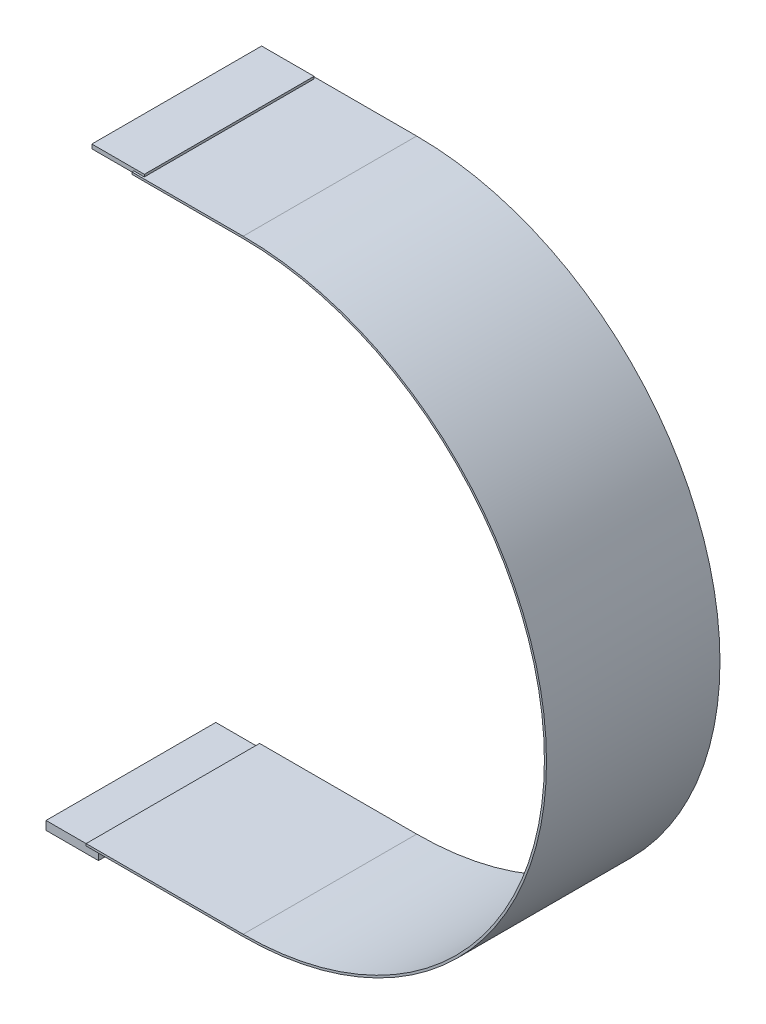
ISO-10303-21;
HEADER;
FILE_DESCRIPTION(('STEP AP214'),'2;1');
FILE_NAME('part.step','',(''),(''),'','','');
FILE_SCHEMA(('AUTOMOTIVE_DESIGN { 1 0 10303 214 1 1 1 1 }'));
ENDSEC;
DATA;
#1=APPLICATION_CONTEXT('core data for automotive mechanical design processes');
#2=APPLICATION_PROTOCOL_DEFINITION('international standard','automotive_design',2000,#1);
#3=PRODUCT_CONTEXT('',#1,'mechanical');
#4=PRODUCT('Part','Part','',(#3));
#5=PRODUCT_RELATED_PRODUCT_CATEGORY('part','',(#4));
#6=PRODUCT_DEFINITION_FORMATION('','',#4);
#7=PRODUCT_DEFINITION_CONTEXT('part definition',#1,'design');
#8=PRODUCT_DEFINITION('design','',#6,#7);
#9=PRODUCT_DEFINITION_SHAPE('','',#8);
#10=(LENGTH_UNIT() NAMED_UNIT(*) SI_UNIT(.MILLI.,.METRE.));
#11=(NAMED_UNIT(*) PLANE_ANGLE_UNIT() SI_UNIT($,.RADIAN.));
#12=(NAMED_UNIT(*) SI_UNIT($,.STERADIAN.) SOLID_ANGLE_UNIT());
#13=UNCERTAINTY_MEASURE_WITH_UNIT(LENGTH_MEASURE(1.E-05),#10,'distance_accuracy_value','');
#14=(GEOMETRIC_REPRESENTATION_CONTEXT(3) GLOBAL_UNCERTAINTY_ASSIGNED_CONTEXT((#13)) GLOBAL_UNIT_ASSIGNED_CONTEXT((#10,
#11,#12)) REPRESENTATION_CONTEXT('',''));
#15=CARTESIAN_POINT('',(0.,0.,0.));
#16=DIRECTION('',(0.,0.,1.));
#17=DIRECTION('',(1.,0.,0.));
#18=AXIS2_PLACEMENT_3D('',#15,#16,#17);
#19=CARTESIAN_POINT('',(0.,0.254000000000004,10.5));
#20=DIRECTION('',(1.,0.,0.));
#21=DIRECTION('',(0.,0.,-1.));
#22=AXIS2_PLACEMENT_3D('',#19,#20,#21);
#23=PLANE('',#22);
#24=DIRECTION('',(0.,0.,-1.));
#25=VECTOR('',#24,1.);
#26=CARTESIAN_POINT('',(0.,0.,10.5));
#27=LINE('',#26,#25);
#28=CARTESIAN_POINT('',(0.,0.,-10.2743));
#29=VERTEX_POINT('',#28);
#30=CARTESIAN_POINT('',(0.,0.,-10.5));
#31=VERTEX_POINT('',#30);
#32=EDGE_CURVE('E352',#29,#31,#27,.T.);
#33=ORIENTED_EDGE('',*,*,#32,.F.);
#34=DIRECTION('',(0.,1.,0.));
#35=VECTOR('',#34,1.);
#36=CARTESIAN_POINT('',(0.,0.254000000000004,-10.2743));
#37=LINE('',#36,#35);
#38=CARTESIAN_POINT('',(0.,0.0253999999999949,-10.2743));
#39=VERTEX_POINT('',#38);
#40=EDGE_CURVE('E77',#29,#39,#37,.T.);
#41=ORIENTED_EDGE('',*,*,#40,.T.);
#42=DIRECTION('',(0.,0.,1.));
#43=VECTOR('',#42,1.);
#44=CARTESIAN_POINT('',(0.,0.0253999999999949,10.5));
#45=LINE('',#44,#43);
#46=CARTESIAN_POINT('',(0.,0.0253999999999949,10.2743));
#47=VERTEX_POINT('',#46);
#48=EDGE_CURVE('E363',#39,#47,#45,.T.);
#49=ORIENTED_EDGE('',*,*,#48,.T.);
#50=DIRECTION('',(0.,-1.,0.));
#51=VECTOR('',#50,1.);
#52=CARTESIAN_POINT('',(0.,0.254000000000004,10.2743));
#53=LINE('',#52,#51);
#54=CARTESIAN_POINT('',(0.,0.,10.2743));
#55=VERTEX_POINT('',#54);
#56=EDGE_CURVE('E277',#47,#55,#53,.T.);
#57=ORIENTED_EDGE('',*,*,#56,.T.);
#58=CARTESIAN_POINT('',(0.,0.,10.5));
#59=VERTEX_POINT('',#58);
#60=EDGE_CURVE('E353',#59,#55,#27,.T.);
#61=ORIENTED_EDGE('',*,*,#60,.F.);
#62=DIRECTION('',(0.,-1.,0.));
#63=VECTOR('',#62,1.);
#64=CARTESIAN_POINT('',(0.,0.254000000000004,10.5));
#65=LINE('',#64,#63);
#66=CARTESIAN_POINT('',(0.,0.254000000000004,10.5));
#67=VERTEX_POINT('',#66);
#68=EDGE_CURVE('E286',#67,#59,#65,.T.);
#69=ORIENTED_EDGE('',*,*,#68,.F.);
#70=DIRECTION('',(0.,0.,-1.));
#71=VECTOR('',#70,1.);
#72=CARTESIAN_POINT('',(0.,0.254000000000004,10.5));
#73=LINE('',#72,#71);
#74=CARTESIAN_POINT('',(0.,0.254000000000004,-10.5));
#75=VERTEX_POINT('',#74);
#76=EDGE_CURVE('E305',#67,#75,#73,.T.);
#77=ORIENTED_EDGE('',*,*,#76,.T.);
#78=DIRECTION('',(0.,-1.,0.));
#79=VECTOR('',#78,1.);
#80=CARTESIAN_POINT('',(0.,0.254000000000004,-10.5));
#81=LINE('',#80,#79);
#82=EDGE_CURVE('E285',#75,#31,#81,.T.);
#83=ORIENTED_EDGE('',*,*,#82,.T.);
#84=EDGE_LOOP('',(#33,#41,#49,#57,#61,#69,#77,#83));
#85=FACE_BOUND('',#84,.T.);
#86=ADVANCED_FACE('F51',(#85),#23,.F.);
#87=CARTESIAN_POINT('',(0.,0.,10.5));
#88=DIRECTION('',(0.,1.,0.));
#89=DIRECTION('',(0.,0.,1.));
#90=AXIS2_PLACEMENT_3D('',#87,#88,#89);
#91=PLANE('',#90);
#92=DIRECTION('',(0.,0.,1.));
#93=VECTOR('',#92,1.);
#94=CARTESIAN_POINT('',(1.27,0.,10.5));
#95=LINE('',#94,#93);
#96=CARTESIAN_POINT('',(1.27,0.,-10.2743));
#97=VERTEX_POINT('',#96);
#98=CARTESIAN_POINT('',(1.27,0.,10.2743));
#99=VERTEX_POINT('',#98);
#100=EDGE_CURVE('E356',#97,#99,#95,.T.);
#101=ORIENTED_EDGE('',*,*,#100,.F.);
#102=DIRECTION('',(-1.,0.,0.));
#103=VECTOR('',#102,1.);
#104=CARTESIAN_POINT('',(0.,0.,-10.2743));
#105=LINE('',#104,#103);
#106=EDGE_CURVE('E361',#97,#29,#105,.T.);
#107=ORIENTED_EDGE('',*,*,#106,.T.);
#108=ORIENTED_EDGE('',*,*,#32,.T.);
#109=DIRECTION('',(1.,0.,0.));
#110=VECTOR('',#109,1.);
#111=CARTESIAN_POINT('',(0.,0.,-10.5));
#112=LINE('',#111,#110);
#113=CARTESIAN_POINT('',(19.01175011,0.,-10.5));
#114=VERTEX_POINT('',#113);
#115=EDGE_CURVE('E308',#31,#114,#112,.T.);
#116=ORIENTED_EDGE('',*,*,#115,.T.);
#117=DIRECTION('',(0.,0.,-1.));
#118=VECTOR('',#117,1.);
#119=CARTESIAN_POINT('',(19.01175011,0.,10.5));
#120=LINE('',#119,#118);
#121=CARTESIAN_POINT('',(19.01175011,0.,10.5));
#122=VERTEX_POINT('',#121);
#123=EDGE_CURVE('E349',#122,#114,#120,.T.);
#124=ORIENTED_EDGE('',*,*,#123,.F.);
#125=DIRECTION('',(1.,0.,0.));
#126=VECTOR('',#125,1.);
#127=CARTESIAN_POINT('',(0.,0.,10.5));
#128=LINE('',#127,#126);
#129=EDGE_CURVE('E289',#59,#122,#128,.T.);
#130=ORIENTED_EDGE('',*,*,#129,.F.);
#131=ORIENTED_EDGE('',*,*,#60,.T.);
#132=DIRECTION('',(1.,0.,0.));
#133=VECTOR('',#132,1.);
#134=CARTESIAN_POINT('',(0.,0.,10.2743));
#135=LINE('',#134,#133);
#136=EDGE_CURVE('E359',#55,#99,#135,.T.);
#137=ORIENTED_EDGE('',*,*,#136,.T.);
#138=EDGE_LOOP('',(#101,#107,#108,#116,#124,#130,#131,#137));
#139=FACE_BOUND('',#138,.T.);
#140=ADVANCED_FACE('F419',(#139),#91,.F.);
#141=CARTESIAN_POINT('',(19.01175011,36.714875008,10.5));
#142=DIRECTION('',(0.,0.,-1.));
#143=DIRECTION('',(-1.,0.,0.));
#144=AXIS2_PLACEMENT_3D('',#141,#142,#143);
#145=CYLINDRICAL_SURFACE('',#144,36.714875008);
#146=CARTESIAN_POINT('',(19.01175011,36.714875008,-10.5));
#147=DIRECTION('',(0.,0.,1.));
#148=DIRECTION('',(1.,0.,0.));
#149=AXIS2_PLACEMENT_3D('',#146,#147,#148);
#150=CIRCLE('',#149,36.714875008);
#151=CARTESIAN_POINT('',(19.01175011,73.429750016,-10.5));
#152=VERTEX_POINT('',#151);
#153=EDGE_CURVE('E311',#114,#152,#150,.T.);
#154=ORIENTED_EDGE('',*,*,#153,.T.);
#155=DIRECTION('',(0.,0.,-1.));
#156=VECTOR('',#155,1.);
#157=CARTESIAN_POINT('',(19.01175011,73.429750016,10.5));
#158=LINE('',#157,#156);
#159=CARTESIAN_POINT('',(19.01175011,73.429750016,10.5));
#160=VERTEX_POINT('',#159);
#161=EDGE_CURVE('E345',#160,#152,#158,.T.);
#162=ORIENTED_EDGE('',*,*,#161,.F.);
#163=CARTESIAN_POINT('',(19.01175011,36.714875008,10.5));
#164=DIRECTION('',(0.,0.,1.));
#165=DIRECTION('',(1.,0.,0.));
#166=AXIS2_PLACEMENT_3D('',#163,#164,#165);
#167=CIRCLE('',#166,36.714875008);
#168=EDGE_CURVE('E292',#122,#160,#167,.T.);
#169=ORIENTED_EDGE('',*,*,#168,.F.);
#170=ORIENTED_EDGE('',*,*,#123,.T.);
#171=EDGE_LOOP('',(#154,#162,#169,#170));
#172=FACE_BOUND('',#171,.T.);
#173=ADVANCED_FACE('F424',(#172),#145,.T.);
#174=CARTESIAN_POINT('',(19.01175011,73.429750016,10.5));
#175=DIRECTION('',(0.,-1.,0.));
#176=DIRECTION('',(0.,0.,-1.));
#177=AXIS2_PLACEMENT_3D('',#174,#175,#176);
#178=PLANE('',#177);
#179=DIRECTION('',(0.,0.,-1.));
#180=VECTOR('',#179,1.);
#181=CARTESIAN_POINT('',(5.549000018,73.429750016,10.5));
#182=LINE('',#181,#180);
#183=CARTESIAN_POINT('',(5.549000018,73.429750016,-10.2743));
#184=VERTEX_POINT('',#183);
#185=CARTESIAN_POINT('',(5.549000018,73.429750016,-10.5));
#186=VERTEX_POINT('',#185);
#187=EDGE_CURVE('E341',#184,#186,#182,.T.);
#188=ORIENTED_EDGE('',*,*,#187,.F.);
#189=DIRECTION('',(1.,0.,0.));
#190=VECTOR('',#189,1.);
#191=CARTESIAN_POINT('',(19.01175011,73.429750016,-10.2743));
#192=LINE('',#191,#190);
#193=CARTESIAN_POINT('',(6.8190000179995,73.429750016,-10.2743));
#194=VERTEX_POINT('',#193);
#195=EDGE_CURVE('E250',#184,#194,#192,.T.);
#196=ORIENTED_EDGE('',*,*,#195,.T.);
#197=DIRECTION('',(0.,0.,1.));
#198=VECTOR('',#197,1.);
#199=CARTESIAN_POINT('',(6.8190000179995,73.429750016,10.5));
#200=LINE('',#199,#198);
#201=CARTESIAN_POINT('',(6.8190000179995,73.429750016,10.2743));
#202=VERTEX_POINT('',#201);
#203=EDGE_CURVE('E11',#194,#202,#200,.T.);
#204=ORIENTED_EDGE('',*,*,#203,.T.);
#205=DIRECTION('',(-1.,0.,0.));
#206=VECTOR('',#205,1.);
#207=CARTESIAN_POINT('',(19.01175011,73.429750016,10.2743));
#208=LINE('',#207,#206);
#209=CARTESIAN_POINT('',(5.549000018,73.429750016,10.2743));
#210=VERTEX_POINT('',#209);
#211=EDGE_CURVE('E242',#202,#210,#208,.T.);
#212=ORIENTED_EDGE('',*,*,#211,.T.);
#213=CARTESIAN_POINT('',(5.549000018,73.429750016,10.5));
#214=VERTEX_POINT('',#213);
#215=EDGE_CURVE('E342',#214,#210,#182,.T.);
#216=ORIENTED_EDGE('',*,*,#215,.F.);
#217=DIRECTION('',(-1.,0.,0.));
#218=VECTOR('',#217,1.);
#219=CARTESIAN_POINT('',(19.01175011,73.429750016,10.5));
#220=LINE('',#219,#218);
#221=EDGE_CURVE('E294',#160,#214,#220,.T.);
#222=ORIENTED_EDGE('',*,*,#221,.F.);
#223=ORIENTED_EDGE('',*,*,#161,.T.);
#224=DIRECTION('',(-1.,0.,0.));
#225=VECTOR('',#224,1.);
#226=CARTESIAN_POINT('',(19.01175011,73.429750016,-10.5));
#227=LINE('',#226,#225);
#228=EDGE_CURVE('E314',#152,#186,#227,.T.);
#229=ORIENTED_EDGE('',*,*,#228,.T.);
#230=EDGE_LOOP('',(#188,#196,#204,#212,#216,#222,#223,#229));
#231=FACE_BOUND('',#230,.T.);
#232=ADVANCED_FACE('F376',(#231),#178,.F.);
#233=CARTESIAN_POINT('',(5.549000018,73.429750016,10.5));
#234=DIRECTION('',(1.,0.,0.));
#235=DIRECTION('',(0.,0.,-1.));
#236=AXIS2_PLACEMENT_3D('',#233,#234,#235);
#237=PLANE('',#236);
#238=DIRECTION('',(0.,0.,-1.));
#239=VECTOR('',#238,1.);
#240=CARTESIAN_POINT('',(5.549000018,73.201150016,10.5));
#241=LINE('',#240,#239);
#242=CARTESIAN_POINT('',(5.549000018,73.201150016,10.2743));
#243=VERTEX_POINT('',#242);
#244=CARTESIAN_POINT('',(5.549000018,73.201150016,-10.2743));
#245=VERTEX_POINT('',#244);
#246=EDGE_CURVE('E365',#243,#245,#241,.T.);
#247=ORIENTED_EDGE('',*,*,#246,.T.);
#248=DIRECTION('',(0.,1.,0.));
#249=VECTOR('',#248,1.);
#250=CARTESIAN_POINT('',(5.549000018,73.429750016,-10.2743));
#251=LINE('',#250,#249);
#252=EDGE_CURVE('E59',#245,#184,#251,.T.);
#253=ORIENTED_EDGE('',*,*,#252,.T.);
#254=ORIENTED_EDGE('',*,*,#187,.T.);
#255=DIRECTION('',(0.,-1.,0.));
#256=VECTOR('',#255,1.);
#257=CARTESIAN_POINT('',(5.549000018,73.429750016,-10.5));
#258=LINE('',#257,#256);
#259=CARTESIAN_POINT('',(5.549000018,73.175750016,-10.5));
#260=VERTEX_POINT('',#259);
#261=EDGE_CURVE('E318',#186,#260,#258,.T.);
#262=ORIENTED_EDGE('',*,*,#261,.T.);
#263=DIRECTION('',(0.,0.,-1.));
#264=VECTOR('',#263,1.);
#265=CARTESIAN_POINT('',(5.549000018,73.175750016,10.5));
#266=LINE('',#265,#264);
#267=CARTESIAN_POINT('',(5.549000018,73.175750016,10.5));
#268=VERTEX_POINT('',#267);
#269=EDGE_CURVE('E337',#268,#260,#266,.T.);
#270=ORIENTED_EDGE('',*,*,#269,.F.);
#271=DIRECTION('',(0.,-1.,0.));
#272=VECTOR('',#271,1.);
#273=CARTESIAN_POINT('',(5.549000018,73.429750016,10.5));
#274=LINE('',#273,#272);
#275=EDGE_CURVE('E296',#214,#268,#274,.T.);
#276=ORIENTED_EDGE('',*,*,#275,.F.);
#277=ORIENTED_EDGE('',*,*,#215,.T.);
#278=DIRECTION('',(0.,-1.,0.));
#279=VECTOR('',#278,1.);
#280=CARTESIAN_POINT('',(5.549000018,73.429750016,10.2743));
#281=LINE('',#280,#279);
#282=EDGE_CURVE('E368',#210,#243,#281,.T.);
#283=ORIENTED_EDGE('',*,*,#282,.T.);
#284=EDGE_LOOP('',(#247,#253,#254,#262,#270,#276,#277,#283));
#285=FACE_BOUND('',#284,.T.);
#286=ADVANCED_FACE('F374',(#285),#237,.F.);
#287=CARTESIAN_POINT('',(19.01175011,73.175750016,10.5));
#288=DIRECTION('',(0.,1.,0.));
#289=DIRECTION('',(0.,0.,1.));
#290=AXIS2_PLACEMENT_3D('',#287,#288,#289);
#291=PLANE('',#290);
#292=DIRECTION('',(1.,0.,0.));
#293=VECTOR('',#292,1.);
#294=CARTESIAN_POINT('',(19.01175011,73.175750016,-10.5));
#295=LINE('',#294,#293);
#296=CARTESIAN_POINT('',(19.01175011,73.175750016,-10.5));
#297=VERTEX_POINT('',#296);
#298=EDGE_CURVE('E321',#260,#297,#295,.T.);
#299=ORIENTED_EDGE('',*,*,#298,.T.);
#300=DIRECTION('',(0.,0.,-1.));
#301=VECTOR('',#300,1.);
#302=CARTESIAN_POINT('',(19.01175011,73.175750016,10.5));
#303=LINE('',#302,#301);
#304=CARTESIAN_POINT('',(19.01175011,73.175750016,10.5));
#305=VERTEX_POINT('',#304);
#306=EDGE_CURVE('E333',#305,#297,#303,.T.);
#307=ORIENTED_EDGE('',*,*,#306,.F.);
#308=DIRECTION('',(1.,0.,0.));
#309=VECTOR('',#308,1.);
#310=CARTESIAN_POINT('',(19.01175011,73.175750016,10.5));
#311=LINE('',#310,#309);
#312=EDGE_CURVE('E298',#268,#305,#311,.T.);
#313=ORIENTED_EDGE('',*,*,#312,.F.);
#314=ORIENTED_EDGE('',*,*,#269,.T.);
#315=EDGE_LOOP('',(#299,#307,#313,#314));
#316=FACE_BOUND('',#315,.T.);
#317=ADVANCED_FACE('F391',(#316),#291,.F.);
#318=CARTESIAN_POINT('',(19.01175011,36.714875008,10.5));
#319=DIRECTION('',(0.,0.,-1.));
#320=DIRECTION('',(-1.,0.,0.));
#321=AXIS2_PLACEMENT_3D('',#318,#319,#320);
#322=CYLINDRICAL_SURFACE('',#321,36.460875008);
#323=CARTESIAN_POINT('',(19.01175011,36.714875008,-10.5));
#324=DIRECTION('',(0.,0.,-1.));
#325=DIRECTION('',(1.,0.,0.));
#326=AXIS2_PLACEMENT_3D('',#323,#324,#325);
#327=CIRCLE('',#326,36.460875008);
#328=CARTESIAN_POINT('',(19.01175011,0.254000000000004,-10.5));
#329=VERTEX_POINT('',#328);
#330=EDGE_CURVE('E324',#297,#329,#327,.T.);
#331=ORIENTED_EDGE('',*,*,#330,.T.);
#332=DIRECTION('',(0.,0.,-1.));
#333=VECTOR('',#332,1.);
#334=CARTESIAN_POINT('',(19.01175011,0.254000000000004,10.5));
#335=LINE('',#334,#333);
#336=CARTESIAN_POINT('',(19.01175011,0.254000000000004,10.5));
#337=VERTEX_POINT('',#336);
#338=EDGE_CURVE('E330',#337,#329,#335,.T.);
#339=ORIENTED_EDGE('',*,*,#338,.F.);
#340=CARTESIAN_POINT('',(19.01175011,36.714875008,10.5));
#341=DIRECTION('',(0.,0.,-1.));
#342=DIRECTION('',(1.,0.,0.));
#343=AXIS2_PLACEMENT_3D('',#340,#341,#342);
#344=CIRCLE('',#343,36.460875008);
#345=EDGE_CURVE('E300',#305,#337,#344,.T.);
#346=ORIENTED_EDGE('',*,*,#345,.F.);
#347=ORIENTED_EDGE('',*,*,#306,.T.);
#348=EDGE_LOOP('',(#331,#339,#346,#347));
#349=FACE_BOUND('',#348,.T.);
#350=ADVANCED_FACE('F466',(#349),#322,.F.);
#351=CARTESIAN_POINT('',(0.,0.254000000000004,10.5));
#352=DIRECTION('',(0.,-1.,0.));
#353=DIRECTION('',(0.,0.,-1.));
#354=AXIS2_PLACEMENT_3D('',#351,#352,#353);
#355=PLANE('',#354);
#356=DIRECTION('',(-1.,0.,0.));
#357=VECTOR('',#356,1.);
#358=CARTESIAN_POINT('',(0.,0.254000000000004,-10.5));
#359=LINE('',#358,#357);
#360=EDGE_CURVE('E290',#329,#75,#359,.T.);
#361=ORIENTED_EDGE('',*,*,#360,.T.);
#362=ORIENTED_EDGE('',*,*,#76,.F.);
#363=DIRECTION('',(-1.,0.,0.));
#364=VECTOR('',#363,1.);
#365=CARTESIAN_POINT('',(0.,0.254000000000004,10.5));
#366=LINE('',#365,#364);
#367=EDGE_CURVE('E302',#337,#67,#366,.T.);
#368=ORIENTED_EDGE('',*,*,#367,.F.);
#369=ORIENTED_EDGE('',*,*,#338,.T.);
#370=EDGE_LOOP('',(#361,#362,#368,#369));
#371=FACE_BOUND('',#370,.T.);
#372=ADVANCED_FACE('F468',(#371),#355,.F.);
#373=CARTESIAN_POINT('',(19.01175011,36.714875008,10.5));
#374=DIRECTION('',(0.,0.,1.));
#375=DIRECTION('',(1.,0.,0.));
#376=AXIS2_PLACEMENT_3D('',#373,#374,#375);
#377=PLANE('',#376);
#378=ORIENTED_EDGE('',*,*,#68,.T.);
#379=ORIENTED_EDGE('',*,*,#129,.T.);
#380=ORIENTED_EDGE('',*,*,#168,.T.);
#381=ORIENTED_EDGE('',*,*,#221,.T.);
#382=ORIENTED_EDGE('',*,*,#275,.T.);
#383=ORIENTED_EDGE('',*,*,#312,.T.);
#384=ORIENTED_EDGE('',*,*,#345,.T.);
#385=ORIENTED_EDGE('',*,*,#367,.T.);
#386=EDGE_LOOP('',(#378,#379,#380,#381,#382,#383,#384,#385));
#387=FACE_BOUND('',#386,.T.);
#388=ADVANCED_FACE('F395',(#387),#377,.T.);
#389=CARTESIAN_POINT('',(19.01175011,36.714875008,-10.5));
#390=DIRECTION('',(0.,0.,1.));
#391=DIRECTION('',(1.,0.,0.));
#392=AXIS2_PLACEMENT_3D('',#389,#390,#391);
#393=PLANE('',#392);
#394=ORIENTED_EDGE('',*,*,#82,.F.);
#395=ORIENTED_EDGE('',*,*,#360,.F.);
#396=ORIENTED_EDGE('',*,*,#330,.F.);
#397=ORIENTED_EDGE('',*,*,#298,.F.);
#398=ORIENTED_EDGE('',*,*,#261,.F.);
#399=ORIENTED_EDGE('',*,*,#228,.F.);
#400=ORIENTED_EDGE('',*,*,#153,.F.);
#401=ORIENTED_EDGE('',*,*,#115,.F.);
#402=EDGE_LOOP('',(#394,#395,#396,#397,#398,#399,#400,#401));
#403=FACE_BOUND('',#402,.T.);
#404=ADVANCED_FACE('F385',(#403),#393,.F.);
#405=CARTESIAN_POINT('',(1.27,0.0253999999999949,-10.2743));
#406=DIRECTION('',(0.,1.,0.));
#407=DIRECTION('',(0.,0.,1.));
#408=AXIS2_PLACEMENT_3D('',#405,#406,#407);
#409=PLANE('',#408);
#410=ORIENTED_EDGE('',*,*,#48,.F.);
#411=DIRECTION('',(-1.,0.,0.));
#412=VECTOR('',#411,1.);
#413=CARTESIAN_POINT('',(1.27,0.0253999999999949,-10.2743));
#414=LINE('',#413,#412);
#415=CARTESIAN_POINT('',(-5.08,0.0253999999999949,-10.2743));
#416=VERTEX_POINT('',#415);
#417=EDGE_CURVE('E275',#39,#416,#414,.T.);
#418=ORIENTED_EDGE('',*,*,#417,.T.);
#419=DIRECTION('',(0.,0.,-1.));
#420=VECTOR('',#419,1.);
#421=CARTESIAN_POINT('',(-5.08,0.0253999999999949,-10.2743));
#422=LINE('',#421,#420);
#423=CARTESIAN_POINT('',(-5.08000000000001,0.0253999999999949,10.2743));
#424=VERTEX_POINT('',#423);
#425=EDGE_CURVE('E263',#424,#416,#422,.T.);
#426=ORIENTED_EDGE('',*,*,#425,.F.);
#427=DIRECTION('',(-1.,0.,0.));
#428=VECTOR('',#427,1.);
#429=CARTESIAN_POINT('',(1.27,0.0253999999999949,10.2743));
#430=LINE('',#429,#428);
#431=EDGE_CURVE('E278',#47,#424,#430,.T.);
#432=ORIENTED_EDGE('',*,*,#431,.F.);
#433=EDGE_LOOP('',(#410,#418,#426,#432));
#434=FACE_BOUND('',#433,.T.);
#435=ADVANCED_FACE('F435',(#434),#409,.T.);
#436=CARTESIAN_POINT('',(1.27,0.0253999999999949,-10.2743));
#437=DIRECTION('',(0.,0.,-1.));
#438=DIRECTION('',(-1.,0.,0.));
#439=AXIS2_PLACEMENT_3D('',#436,#437,#438);
#440=PLANE('',#439);
#441=ORIENTED_EDGE('',*,*,#40,.F.);
#442=ORIENTED_EDGE('',*,*,#106,.F.);
#443=DIRECTION('',(0.,-1.,0.));
#444=VECTOR('',#443,1.);
#445=CARTESIAN_POINT('',(1.27,0.0253999999999949,-10.2743));
#446=LINE('',#445,#444);
#447=CARTESIAN_POINT('',(1.27,-1.016,-10.2743));
#448=VERTEX_POINT('',#447);
#449=EDGE_CURVE('E266',#97,#448,#446,.T.);
#450=ORIENTED_EDGE('',*,*,#449,.T.);
#451=DIRECTION('',(-1.,0.,0.));
#452=VECTOR('',#451,1.);
#453=CARTESIAN_POINT('',(1.27,-1.016,-10.2743));
#454=LINE('',#453,#452);
#455=CARTESIAN_POINT('',(-5.08,-1.016,-10.2743));
#456=VERTEX_POINT('',#455);
#457=EDGE_CURVE('E274',#448,#456,#454,.T.);
#458=ORIENTED_EDGE('',*,*,#457,.T.);
#459=DIRECTION('',(0.,-1.,0.));
#460=VECTOR('',#459,1.);
#461=CARTESIAN_POINT('',(-5.08,0.0253999999999949,-10.2743));
#462=LINE('',#461,#460);
#463=EDGE_CURVE('E254',#416,#456,#462,.T.);
#464=ORIENTED_EDGE('',*,*,#463,.F.);
#465=ORIENTED_EDGE('',*,*,#417,.F.);
#466=EDGE_LOOP('',(#441,#442,#450,#458,#464,#465));
#467=FACE_BOUND('',#466,.T.);
#468=ADVANCED_FACE('F430',(#467),#440,.T.);
#469=CARTESIAN_POINT('',(1.27,0.0253999999999949,10.2743));
#470=DIRECTION('',(0.,0.,1.));
#471=DIRECTION('',(1.,0.,0.));
#472=AXIS2_PLACEMENT_3D('',#469,#470,#471);
#473=PLANE('',#472);
#474=ORIENTED_EDGE('',*,*,#56,.F.);
#475=ORIENTED_EDGE('',*,*,#431,.T.);
#476=DIRECTION('',(0.,1.,0.));
#477=VECTOR('',#476,1.);
#478=CARTESIAN_POINT('',(-5.08000000000001,0.0253999999999949,10.2743));
#479=LINE('',#478,#477);
#480=CARTESIAN_POINT('',(-5.08000000000001,-1.016,10.2743));
#481=VERTEX_POINT('',#480);
#482=EDGE_CURVE('E260',#481,#424,#479,.T.);
#483=ORIENTED_EDGE('',*,*,#482,.F.);
#484=DIRECTION('',(-1.,0.,0.));
#485=VECTOR('',#484,1.);
#486=CARTESIAN_POINT('',(1.27,-1.016,10.2743));
#487=LINE('',#486,#485);
#488=CARTESIAN_POINT('',(1.27,-1.016,10.2743));
#489=VERTEX_POINT('',#488);
#490=EDGE_CURVE('E280',#489,#481,#487,.T.);
#491=ORIENTED_EDGE('',*,*,#490,.F.);
#492=DIRECTION('',(0.,1.,0.));
#493=VECTOR('',#492,1.);
#494=CARTESIAN_POINT('',(1.27,0.0253999999999949,10.2743));
#495=LINE('',#494,#493);
#496=EDGE_CURVE('E271',#489,#99,#495,.T.);
#497=ORIENTED_EDGE('',*,*,#496,.T.);
#498=ORIENTED_EDGE('',*,*,#136,.F.);
#499=EDGE_LOOP('',(#474,#475,#483,#491,#497,#498));
#500=FACE_BOUND('',#499,.T.);
#501=ADVANCED_FACE('F443',(#500),#473,.T.);
#502=CARTESIAN_POINT('',(1.27,0.,0.));
#503=DIRECTION('',(-1.,0.,0.));
#504=DIRECTION('',(0.,0.,1.));
#505=AXIS2_PLACEMENT_3D('',#502,#503,#504);
#506=PLANE('',#505);
#507=ORIENTED_EDGE('',*,*,#449,.F.);
#508=ORIENTED_EDGE('',*,*,#100,.T.);
#509=ORIENTED_EDGE('',*,*,#496,.F.);
#510=DIRECTION('',(0.,0.,1.));
#511=VECTOR('',#510,1.);
#512=CARTESIAN_POINT('',(1.27,-1.016,-10.2743));
#513=LINE('',#512,#511);
#514=EDGE_CURVE('E268',#448,#489,#513,.T.);
#515=ORIENTED_EDGE('',*,*,#514,.F.);
#516=EDGE_LOOP('',(#507,#508,#509,#515));
#517=FACE_BOUND('',#516,.T.);
#518=ADVANCED_FACE('F481',(#517),#506,.F.);
#519=CARTESIAN_POINT('',(1.27,-1.016,-10.2743));
#520=DIRECTION('',(0.,-1.,0.));
#521=DIRECTION('',(0.,0.,-1.));
#522=AXIS2_PLACEMENT_3D('',#519,#520,#521);
#523=PLANE('',#522);
#524=ORIENTED_EDGE('',*,*,#490,.T.);
#525=DIRECTION('',(0.,0.,1.));
#526=VECTOR('',#525,1.);
#527=CARTESIAN_POINT('',(-5.08,-1.016,-10.2743));
#528=LINE('',#527,#526);
#529=EDGE_CURVE('E257',#456,#481,#528,.T.);
#530=ORIENTED_EDGE('',*,*,#529,.F.);
#531=ORIENTED_EDGE('',*,*,#457,.F.);
#532=ORIENTED_EDGE('',*,*,#514,.T.);
#533=EDGE_LOOP('',(#524,#530,#531,#532));
#534=FACE_BOUND('',#533,.T.);
#535=ADVANCED_FACE('F478',(#534),#523,.T.);
#536=CARTESIAN_POINT('',(-5.08,0.,0.));
#537=DIRECTION('',(-1.,0.,0.));
#538=DIRECTION('',(0.,0.,1.));
#539=AXIS2_PLACEMENT_3D('',#536,#537,#538);
#540=PLANE('',#539);
#541=ORIENTED_EDGE('',*,*,#463,.T.);
#542=ORIENTED_EDGE('',*,*,#529,.T.);
#543=ORIENTED_EDGE('',*,*,#482,.T.);
#544=ORIENTED_EDGE('',*,*,#425,.T.);
#545=EDGE_LOOP('',(#541,#542,#543,#544));
#546=FACE_BOUND('',#545,.T.);
#547=ADVANCED_FACE('F438',(#546),#540,.T.);
#548=CARTESIAN_POINT('',(6.819000018,0.,0.));
#549=DIRECTION('',(1.,0.,0.));
#550=DIRECTION('',(0.,1.,0.));
#551=AXIS2_PLACEMENT_3D('',#548,#549,#550);
#552=PLANE('',#551);
#553=ORIENTED_EDGE('',*,*,#203,.F.);
#554=DIRECTION('',(0.,-1.,0.));
#555=VECTOR('',#554,1.);
#556=CARTESIAN_POINT('',(6.8190000179995,73.201150016,-10.2743));
#557=LINE('',#556,#555);
#558=CARTESIAN_POINT('',(6.8190000179995,73.709150016,-10.2743));
#559=VERTEX_POINT('',#558);
#560=EDGE_CURVE('E230',#559,#194,#557,.T.);
#561=ORIENTED_EDGE('',*,*,#560,.F.);
#562=DIRECTION('',(0.,0.,-1.));
#563=VECTOR('',#562,1.);
#564=CARTESIAN_POINT('',(6.8190000179995,73.709150016,-10.2743));
#565=LINE('',#564,#563);
#566=CARTESIAN_POINT('',(6.81900001799949,73.709150016,10.2743));
#567=VERTEX_POINT('',#566);
#568=EDGE_CURVE('E205',#567,#559,#565,.T.);
#569=ORIENTED_EDGE('',*,*,#568,.F.);
#570=DIRECTION('',(0.,1.,0.));
#571=VECTOR('',#570,1.);
#572=CARTESIAN_POINT('',(6.8190000179995,73.201150016,10.2743));
#573=LINE('',#572,#571);
#574=EDGE_CURVE('E234',#202,#567,#573,.T.);
#575=ORIENTED_EDGE('',*,*,#574,.F.);
#576=EDGE_LOOP('',(#553,#561,#569,#575));
#577=FACE_BOUND('',#576,.T.);
#578=ADVANCED_FACE('F404',(#577),#552,.T.);
#579=CARTESIAN_POINT('',(6.8190000179995,73.201150016,-10.2743));
#580=DIRECTION('',(0.,0.,-1.));
#581=DIRECTION('',(-1.,0.,0.));
#582=AXIS2_PLACEMENT_3D('',#579,#580,#581);
#583=PLANE('',#582);
#584=ORIENTED_EDGE('',*,*,#195,.F.);
#585=ORIENTED_EDGE('',*,*,#252,.F.);
#586=DIRECTION('',(-1.,0.,0.));
#587=VECTOR('',#586,1.);
#588=CARTESIAN_POINT('',(6.8190000179995,73.201150016,-10.2743));
#589=LINE('',#588,#587);
#590=CARTESIAN_POINT('',(0.469000017999495,73.201150016,-10.2743));
#591=VERTEX_POINT('',#590);
#592=EDGE_CURVE('E69',#245,#591,#589,.T.);
#593=ORIENTED_EDGE('',*,*,#592,.T.);
#594=DIRECTION('',(0.,-1.,0.));
#595=VECTOR('',#594,1.);
#596=CARTESIAN_POINT('',(0.469000017999495,73.201150016,-10.2743));
#597=LINE('',#596,#595);
#598=CARTESIAN_POINT('',(0.469000017999491,73.709150016,-10.2743));
#599=VERTEX_POINT('',#598);
#600=EDGE_CURVE('E200',#599,#591,#597,.T.);
#601=ORIENTED_EDGE('',*,*,#600,.F.);
#602=DIRECTION('',(-1.,0.,0.));
#603=VECTOR('',#602,1.);
#604=CARTESIAN_POINT('',(6.8190000179995,73.709150016,-10.2743));
#605=LINE('',#604,#603);
#606=EDGE_CURVE('E239',#559,#599,#605,.T.);
#607=ORIENTED_EDGE('',*,*,#606,.F.);
#608=ORIENTED_EDGE('',*,*,#560,.T.);
#609=EDGE_LOOP('',(#584,#585,#593,#601,#607,#608));
#610=FACE_BOUND('',#609,.T.);
#611=ADVANCED_FACE('F198',(#610),#583,.T.);
#612=CARTESIAN_POINT('',(6.8190000179995,73.201150016,10.2743));
#613=DIRECTION('',(0.,0.,1.));
#614=DIRECTION('',(1.,0.,0.));
#615=AXIS2_PLACEMENT_3D('',#612,#613,#614);
#616=PLANE('',#615);
#617=ORIENTED_EDGE('',*,*,#211,.F.);
#618=ORIENTED_EDGE('',*,*,#574,.T.);
#619=DIRECTION('',(-1.,0.,0.));
#620=VECTOR('',#619,1.);
#621=CARTESIAN_POINT('',(6.81900001799949,73.709150016,10.2743));
#622=LINE('',#621,#620);
#623=CARTESIAN_POINT('',(0.469000017999494,73.709150016,10.2743));
#624=VERTEX_POINT('',#623);
#625=EDGE_CURVE('E243',#567,#624,#622,.T.);
#626=ORIENTED_EDGE('',*,*,#625,.T.);
#627=DIRECTION('',(0.,1.,0.));
#628=VECTOR('',#627,1.);
#629=CARTESIAN_POINT('',(0.469000017999498,73.201150016,10.2743));
#630=LINE('',#629,#628);
#631=CARTESIAN_POINT('',(0.469000017999498,73.201150016,10.2743));
#632=VERTEX_POINT('',#631);
#633=EDGE_CURVE('E215',#632,#624,#630,.T.);
#634=ORIENTED_EDGE('',*,*,#633,.F.);
#635=DIRECTION('',(-1.,0.,0.));
#636=VECTOR('',#635,1.);
#637=CARTESIAN_POINT('',(6.8190000179995,73.201150016,10.2743));
#638=LINE('',#637,#636);
#639=EDGE_CURVE('E204',#243,#632,#638,.T.);
#640=ORIENTED_EDGE('',*,*,#639,.F.);
#641=ORIENTED_EDGE('',*,*,#282,.F.);
#642=EDGE_LOOP('',(#617,#618,#626,#634,#640,#641));
#643=FACE_BOUND('',#642,.T.);
#644=ADVANCED_FACE('F400',(#643),#616,.T.);
#645=CARTESIAN_POINT('',(6.8190000179995,73.201150016,-10.2743));
#646=DIRECTION('',(0.,-1.,0.));
#647=DIRECTION('',(1.,0.,0.));
#648=AXIS2_PLACEMENT_3D('',#645,#646,#647);
#649=PLANE('',#648);
#650=ORIENTED_EDGE('',*,*,#246,.F.);
#651=ORIENTED_EDGE('',*,*,#639,.T.);
#652=DIRECTION('',(0.,0.,1.));
#653=VECTOR('',#652,1.);
#654=CARTESIAN_POINT('',(0.469000017999495,73.201150016,-10.2743));
#655=LINE('',#654,#653);
#656=EDGE_CURVE('E208',#591,#632,#655,.T.);
#657=ORIENTED_EDGE('',*,*,#656,.F.);
#658=ORIENTED_EDGE('',*,*,#592,.F.);
#659=EDGE_LOOP('',(#650,#651,#657,#658));
#660=FACE_BOUND('',#659,.T.);
#661=ADVANCED_FACE('F209',(#660),#649,.T.);
#662=CARTESIAN_POINT('',(6.8190000179995,73.709150016,-10.2743));
#663=DIRECTION('',(0.,1.,0.));
#664=DIRECTION('',(-1.,0.,0.));
#665=AXIS2_PLACEMENT_3D('',#662,#663,#664);
#666=PLANE('',#665);
#667=ORIENTED_EDGE('',*,*,#606,.T.);
#668=DIRECTION('',(0.,0.,-1.));
#669=VECTOR('',#668,1.);
#670=CARTESIAN_POINT('',(0.469000017999491,73.709150016,-10.2743));
#671=LINE('',#670,#669);
#672=EDGE_CURVE('E220',#624,#599,#671,.T.);
#673=ORIENTED_EDGE('',*,*,#672,.F.);
#674=ORIENTED_EDGE('',*,*,#625,.F.);
#675=ORIENTED_EDGE('',*,*,#568,.T.);
#676=EDGE_LOOP('',(#667,#673,#674,#675));
#677=FACE_BOUND('',#676,.T.);
#678=ADVANCED_FACE('F407',(#677),#666,.T.);
#679=CARTESIAN_POINT('',(0.469000017999997,0.,0.));
#680=DIRECTION('',(1.,0.,0.));
#681=DIRECTION('',(0.,1.,0.));
#682=AXIS2_PLACEMENT_3D('',#679,#680,#681);
#683=PLANE('',#682);
#684=ORIENTED_EDGE('',*,*,#600,.T.);
#685=ORIENTED_EDGE('',*,*,#656,.T.);
#686=ORIENTED_EDGE('',*,*,#633,.T.);
#687=ORIENTED_EDGE('',*,*,#672,.T.);
#688=EDGE_LOOP('',(#684,#685,#686,#687));
#689=FACE_BOUND('',#688,.T.);
#690=ADVANCED_FACE('F218',(#689),#683,.F.);
#691=CLOSED_SHELL('',(#86,#140,#173,#232,#286,#317,#350,#372,#388,#404,#435,#468,#501,#518,#535,
#547,#578,#611,#644,#661,#678,#690));
#692=MANIFOLD_SOLID_BREP('B2',#691);
#693=ADVANCED_BREP_SHAPE_REPRESENTATION('',(#18,#692),#14);
#694=SHAPE_DEFINITION_REPRESENTATION(#9,#693);
ENDSEC;
END-ISO-10303-21;
